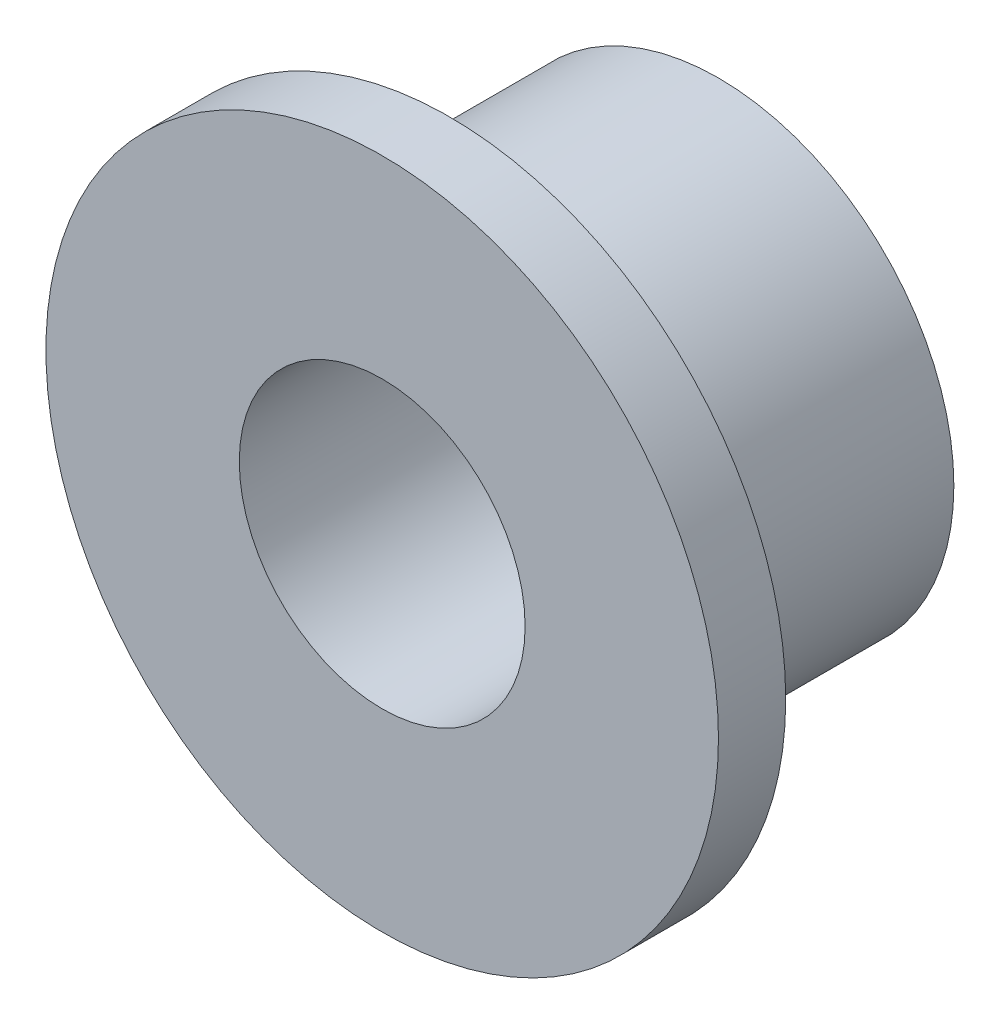
ISO-10303-21;
HEADER;
FILE_DESCRIPTION(('STEP AP214'),'2;1');
FILE_NAME('part.step','',(''),(''),'','','');
FILE_SCHEMA(('AUTOMOTIVE_DESIGN { 1 0 10303 214 1 1 1 1 }'));
ENDSEC;
DATA;
#1=APPLICATION_CONTEXT('core data for automotive mechanical design processes');
#2=APPLICATION_PROTOCOL_DEFINITION('international standard','automotive_design',2000,#1);
#3=PRODUCT_CONTEXT('',#1,'mechanical');
#4=PRODUCT('Part','Part','',(#3));
#5=PRODUCT_RELATED_PRODUCT_CATEGORY('part','',(#4));
#6=PRODUCT_DEFINITION_FORMATION('','',#4);
#7=PRODUCT_DEFINITION_CONTEXT('part definition',#1,'design');
#8=PRODUCT_DEFINITION('design','',#6,#7);
#9=PRODUCT_DEFINITION_SHAPE('','',#8);
#10=(LENGTH_UNIT() NAMED_UNIT(*) SI_UNIT(.MILLI.,.METRE.));
#11=(NAMED_UNIT(*) PLANE_ANGLE_UNIT() SI_UNIT($,.RADIAN.));
#12=(NAMED_UNIT(*) SI_UNIT($,.STERADIAN.) SOLID_ANGLE_UNIT());
#13=UNCERTAINTY_MEASURE_WITH_UNIT(LENGTH_MEASURE(1.E-05),#10,'distance_accuracy_value','');
#14=(GEOMETRIC_REPRESENTATION_CONTEXT(3) GLOBAL_UNCERTAINTY_ASSIGNED_CONTEXT((#13)) GLOBAL_UNIT_ASSIGNED_CONTEXT((#10,
#11,#12)) REPRESENTATION_CONTEXT('',''));
#15=CARTESIAN_POINT('',(0.,0.,0.));
#16=DIRECTION('',(0.,0.,1.));
#17=DIRECTION('',(1.,0.,0.));
#18=AXIS2_PLACEMENT_3D('',#15,#16,#17);
#19=CARTESIAN_POINT('',(0.,0.,10.));
#20=DIRECTION('',(0.,0.,-1.));
#21=DIRECTION('',(-1.,0.,0.));
#22=AXIS2_PLACEMENT_3D('',#19,#20,#21);
#23=CYLINDRICAL_SURFACE('',#22,7.);
#24=CARTESIAN_POINT('',(0.,0.,0.));
#25=DIRECTION('',(0.,0.,1.));
#26=DIRECTION('',(1.,0.,0.));
#27=AXIS2_PLACEMENT_3D('',#24,#25,#26);
#28=CIRCLE('',#27,7.);
#29=CARTESIAN_POINT('',(7.,0.,0.));
#30=VERTEX_POINT('',#29);
#31=EDGE_CURVE('E41',#30,#30,#28,.T.);
#32=ORIENTED_EDGE('',*,*,#31,.T.);
#33=EDGE_LOOP('',(#32));
#34=FACE_BOUND('',#33,.T.);
#35=CARTESIAN_POINT('',(0.,0.,8.));
#36=DIRECTION('',(0.,0.,1.));
#37=DIRECTION('',(1.,0.,0.));
#38=AXIS2_PLACEMENT_3D('',#35,#36,#37);
#39=CIRCLE('',#38,7.);
#40=CARTESIAN_POINT('',(7.,0.,8.));
#41=VERTEX_POINT('',#40);
#42=EDGE_CURVE('E10',#41,#41,#39,.T.);
#43=ORIENTED_EDGE('',*,*,#42,.F.);
#44=EDGE_LOOP('',(#43));
#45=FACE_BOUND('',#44,.T.);
#46=ADVANCED_FACE('F35',(#34,#45),#23,.T.);
#47=CARTESIAN_POINT('',(0.,0.,10.));
#48=DIRECTION('',(0.,0.,1.));
#49=DIRECTION('',(1.,0.,0.));
#50=AXIS2_PLACEMENT_3D('',#47,#48,#49);
#51=PLANE('',#50);
#52=CARTESIAN_POINT('',(0.,0.,10.));
#53=DIRECTION('',(0.,0.,1.));
#54=DIRECTION('',(1.,0.,0.));
#55=AXIS2_PLACEMENT_3D('',#52,#53,#54);
#56=CIRCLE('',#55,4.25);
#57=CARTESIAN_POINT('',(4.25,0.,10.));
#58=VERTEX_POINT('',#57);
#59=EDGE_CURVE('E45',#58,#58,#56,.T.);
#60=ORIENTED_EDGE('',*,*,#59,.F.);
#61=EDGE_LOOP('',(#60));
#62=FACE_BOUND('',#61,.T.);
#63=CARTESIAN_POINT('',(0.,0.,10.));
#64=DIRECTION('',(0.,0.,1.));
#65=DIRECTION('',(1.,0.,0.));
#66=AXIS2_PLACEMENT_3D('',#63,#64,#65);
#67=CIRCLE('',#66,10.);
#68=CARTESIAN_POINT('',(10.,0.,10.));
#69=VERTEX_POINT('',#68);
#70=EDGE_CURVE('E55',#69,#69,#67,.T.);
#71=ORIENTED_EDGE('',*,*,#70,.T.);
#72=EDGE_LOOP('',(#71));
#73=FACE_BOUND('',#72,.T.);
#74=ADVANCED_FACE('F73',(#62,#73),#51,.T.);
#75=CARTESIAN_POINT('',(0.,0.,0.));
#76=DIRECTION('',(0.,0.,1.));
#77=DIRECTION('',(1.,0.,0.));
#78=AXIS2_PLACEMENT_3D('',#75,#76,#77);
#79=PLANE('',#78);
#80=ORIENTED_EDGE('',*,*,#31,.F.);
#81=EDGE_LOOP('',(#80));
#82=FACE_BOUND('',#81,.T.);
#83=CARTESIAN_POINT('',(0.,0.,0.));
#84=DIRECTION('',(0.,0.,1.));
#85=DIRECTION('',(1.,0.,0.));
#86=AXIS2_PLACEMENT_3D('',#83,#84,#85);
#87=CIRCLE('',#86,4.25);
#88=CARTESIAN_POINT('',(4.25,0.,0.));
#89=VERTEX_POINT('',#88);
#90=EDGE_CURVE('E49',#89,#89,#87,.T.);
#91=ORIENTED_EDGE('',*,*,#90,.T.);
#92=EDGE_LOOP('',(#91));
#93=FACE_BOUND('',#92,.T.);
#94=ADVANCED_FACE('F77',(#82,#93),#79,.F.);
#95=CARTESIAN_POINT('',(0.,0.,10.));
#96=DIRECTION('',(0.,0.,-1.));
#97=DIRECTION('',(-1.,0.,0.));
#98=AXIS2_PLACEMENT_3D('',#95,#96,#97);
#99=CYLINDRICAL_SURFACE('',#98,4.25);
#100=ORIENTED_EDGE('',*,*,#59,.T.);
#101=EDGE_LOOP('',(#100));
#102=FACE_BOUND('',#101,.T.);
#103=ORIENTED_EDGE('',*,*,#90,.F.);
#104=EDGE_LOOP('',(#103));
#105=FACE_BOUND('',#104,.T.);
#106=ADVANCED_FACE('F70',(#102,#105),#99,.F.);
#107=CARTESIAN_POINT('',(0.,0.,8.));
#108=DIRECTION('',(0.,0.,1.));
#109=DIRECTION('',(1.,0.,0.));
#110=AXIS2_PLACEMENT_3D('',#107,#108,#109);
#111=CYLINDRICAL_SURFACE('',#110,10.);
#112=CARTESIAN_POINT('',(0.,0.,8.));
#113=DIRECTION('',(0.,0.,1.));
#114=DIRECTION('',(1.,0.,0.));
#115=AXIS2_PLACEMENT_3D('',#112,#113,#114);
#116=CIRCLE('',#115,10.);
#117=CARTESIAN_POINT('',(10.,0.,8.));
#118=VERTEX_POINT('',#117);
#119=EDGE_CURVE('E53',#118,#118,#116,.T.);
#120=ORIENTED_EDGE('',*,*,#119,.T.);
#121=EDGE_LOOP('',(#120));
#122=FACE_BOUND('',#121,.T.);
#123=ORIENTED_EDGE('',*,*,#70,.F.);
#124=EDGE_LOOP('',(#123));
#125=FACE_BOUND('',#124,.T.);
#126=ADVANCED_FACE('F61',(#122,#125),#111,.T.);
#127=CARTESIAN_POINT('',(0.,0.,8.));
#128=DIRECTION('',(0.,0.,1.));
#129=DIRECTION('',(1.,0.,0.));
#130=AXIS2_PLACEMENT_3D('',#127,#128,#129);
#131=PLANE('',#130);
#132=ORIENTED_EDGE('',*,*,#42,.T.);
#133=EDGE_LOOP('',(#132));
#134=FACE_BOUND('',#133,.T.);
#135=ORIENTED_EDGE('',*,*,#119,.F.);
#136=EDGE_LOOP('',(#135));
#137=FACE_BOUND('',#136,.T.);
#138=ADVANCED_FACE('F64',(#134,#137),#131,.F.);
#139=CLOSED_SHELL('',(#46,#74,#94,#106,#126,#138));
#140=MANIFOLD_SOLID_BREP('B2',#139);
#141=ADVANCED_BREP_SHAPE_REPRESENTATION('',(#18,#140),#14);
#142=SHAPE_DEFINITION_REPRESENTATION(#9,#141);
ENDSEC;
END-ISO-10303-21;
